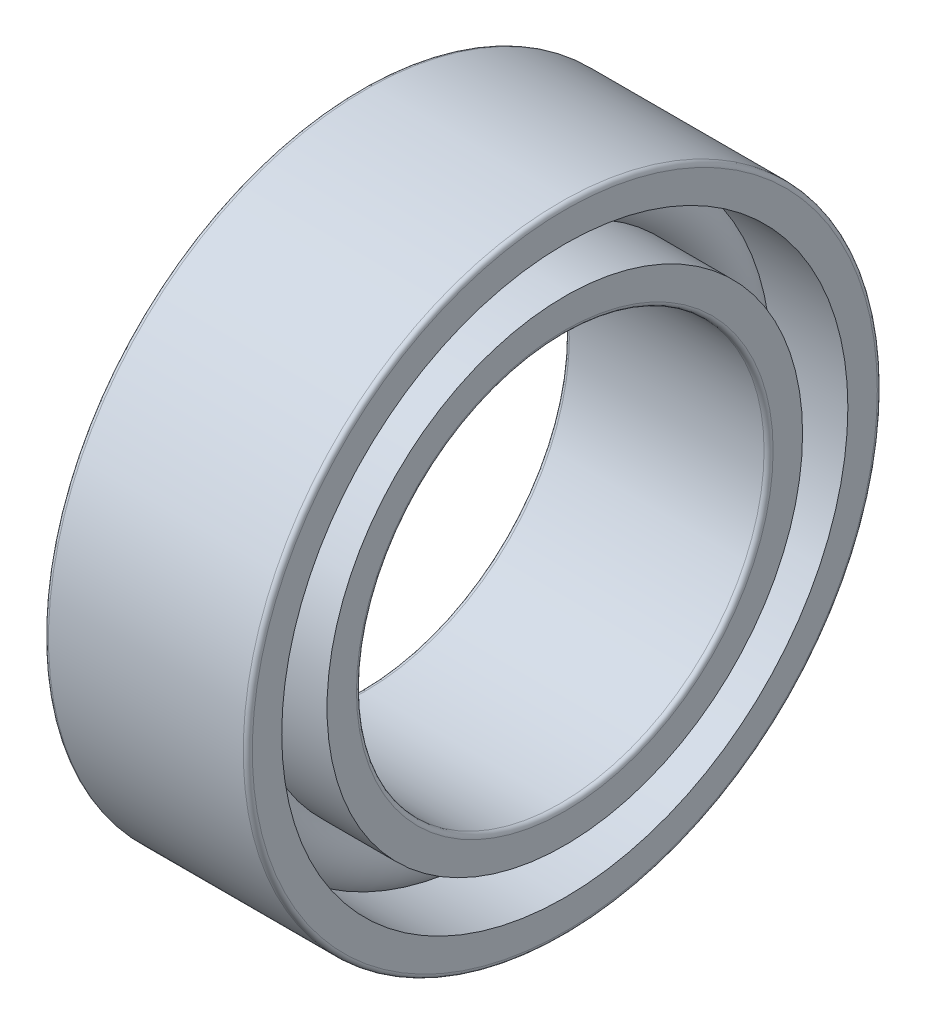
ISO-10303-21;
HEADER;
FILE_DESCRIPTION(('STEP AP214'),'2;1');
FILE_NAME('part.step','',(''),(''),'','','');
FILE_SCHEMA(('AUTOMOTIVE_DESIGN { 1 0 10303 214 1 1 1 1 }'));
ENDSEC;
DATA;
#1=APPLICATION_CONTEXT('core data for automotive mechanical design processes');
#2=APPLICATION_PROTOCOL_DEFINITION('international standard','automotive_design',2000,#1);
#3=PRODUCT_CONTEXT('',#1,'mechanical');
#4=PRODUCT('Part','Part','',(#3));
#5=PRODUCT_RELATED_PRODUCT_CATEGORY('part','',(#4));
#6=PRODUCT_DEFINITION_FORMATION('','',#4);
#7=PRODUCT_DEFINITION_CONTEXT('part definition',#1,'design');
#8=PRODUCT_DEFINITION('design','',#6,#7);
#9=PRODUCT_DEFINITION_SHAPE('','',#8);
#10=(LENGTH_UNIT() NAMED_UNIT(*) SI_UNIT(.MILLI.,.METRE.));
#11=(NAMED_UNIT(*) PLANE_ANGLE_UNIT() SI_UNIT($,.RADIAN.));
#12=(NAMED_UNIT(*) SI_UNIT($,.STERADIAN.) SOLID_ANGLE_UNIT());
#13=UNCERTAINTY_MEASURE_WITH_UNIT(LENGTH_MEASURE(1.E-05),#10,'distance_accuracy_value','');
#14=(GEOMETRIC_REPRESENTATION_CONTEXT(3) GLOBAL_UNCERTAINTY_ASSIGNED_CONTEXT((#13)) GLOBAL_UNIT_ASSIGNED_CONTEXT((#10,
#11,#12)) REPRESENTATION_CONTEXT('',''));
#15=CARTESIAN_POINT('',(0.,0.,0.));
#16=DIRECTION('',(0.,0.,1.));
#17=DIRECTION('',(1.,0.,0.));
#18=AXIS2_PLACEMENT_3D('',#15,#16,#17);
#19=CARTESIAN_POINT('',(0.,0.,0.));
#20=DIRECTION('',(-1.,0.,0.));
#21=DIRECTION('',(0.,0.,1.));
#22=AXIS2_PLACEMENT_3D('',#19,#20,#21);
#23=TOROIDAL_SURFACE('',#22,5.75,0.75);
#24=CARTESIAN_POINT('',(0.559016994374943,0.,0.));
#25=DIRECTION('',(-1.,0.,0.));
#26=DIRECTION('',(0.,0.,1.));
#27=AXIS2_PLACEMENT_3D('',#24,#25,#26);
#28=CIRCLE('',#27,6.25000000000001);
#29=CARTESIAN_POINT('',(0.559016994374943,0.,6.25000000000001));
#30=VERTEX_POINT('',#29);
#31=EDGE_CURVE('E37',#30,#30,#28,.F.);
#32=ORIENTED_EDGE('',*,*,#31,.T.);
#33=EDGE_LOOP('',(#32));
#34=FACE_BOUND('',#33,.T.);
#35=CARTESIAN_POINT('',(0.559016994374947,0.,0.));
#36=DIRECTION('',(-1.,0.,0.));
#37=DIRECTION('',(0.,0.,1.));
#38=AXIS2_PLACEMENT_3D('',#35,#36,#37);
#39=CIRCLE('',#38,5.25);
#40=CARTESIAN_POINT('',(0.559016994374947,0.,5.25));
#41=VERTEX_POINT('',#40);
#42=EDGE_CURVE('E10',#41,#41,#39,.T.);
#43=ORIENTED_EDGE('',*,*,#42,.T.);
#44=EDGE_LOOP('',(#43));
#45=FACE_BOUND('',#44,.T.);
#46=ADVANCED_FACE('F33',(#34,#45),#23,.T.);
#47=CARTESIAN_POINT('',(-20.6375,0.,0.));
#48=DIRECTION('',(1.,0.,0.));
#49=DIRECTION('',(0.,0.,-1.));
#50=AXIS2_PLACEMENT_3D('',#47,#48,#49);
#51=CYLINDRICAL_SURFACE('',#50,5.25);
#52=CARTESIAN_POINT('',(2.25,0.,0.));
#53=DIRECTION('',(1.,0.,0.));
#54=DIRECTION('',(0.,0.,-1.));
#55=AXIS2_PLACEMENT_3D('',#52,#53,#54);
#56=CIRCLE('',#55,5.25);
#57=CARTESIAN_POINT('',(2.25,0.,-5.25));
#58=VERTEX_POINT('',#57);
#59=EDGE_CURVE('E46',#58,#58,#56,.T.);
#60=ORIENTED_EDGE('',*,*,#59,.F.);
#61=EDGE_LOOP('',(#60));
#62=FACE_BOUND('',#61,.T.);
#63=ORIENTED_EDGE('',*,*,#42,.F.);
#64=EDGE_LOOP('',(#63));
#65=FACE_BOUND('',#64,.T.);
#66=ADVANCED_FACE('F85',(#62,#65),#51,.T.);
#67=CARTESIAN_POINT('',(-20.6375,0.,0.));
#68=DIRECTION('',(1.,0.,0.));
#69=DIRECTION('',(0.,0.,-1.));
#70=AXIS2_PLACEMENT_3D('',#67,#68,#69);
#71=CYLINDRICAL_SURFACE('',#70,5.25);
#72=CARTESIAN_POINT('',(-2.25,0.,0.));
#73=DIRECTION('',(1.,0.,0.));
#74=DIRECTION('',(0.,0.,-1.));
#75=AXIS2_PLACEMENT_3D('',#72,#73,#74);
#76=CIRCLE('',#75,5.25);
#77=CARTESIAN_POINT('',(-2.25,0.,-5.25));
#78=VERTEX_POINT('',#77);
#79=EDGE_CURVE('E55',#78,#78,#76,.T.);
#80=ORIENTED_EDGE('',*,*,#79,.T.);
#81=EDGE_LOOP('',(#80));
#82=FACE_BOUND('',#81,.T.);
#83=CARTESIAN_POINT('',(-0.559016994374947,0.,0.));
#84=DIRECTION('',(1.,0.,0.));
#85=DIRECTION('',(0.,0.,-1.));
#86=AXIS2_PLACEMENT_3D('',#83,#84,#85);
#87=CIRCLE('',#86,5.25);
#88=CARTESIAN_POINT('',(-0.559016994374947,0.,-5.25));
#89=VERTEX_POINT('',#88);
#90=EDGE_CURVE('E41',#89,#89,#87,.T.);
#91=ORIENTED_EDGE('',*,*,#90,.F.);
#92=EDGE_LOOP('',(#91));
#93=FACE_BOUND('',#92,.T.);
#94=ADVANCED_FACE('F88',(#82,#93),#71,.T.);
#95=CARTESIAN_POINT('',(2.25,4.6,0.));
#96=DIRECTION('',(1.,0.,0.));
#97=DIRECTION('',(0.,0.,-1.));
#98=AXIS2_PLACEMENT_3D('',#95,#96,#97);
#99=PLANE('',#98);
#100=ORIENTED_EDGE('',*,*,#59,.T.);
#101=EDGE_LOOP('',(#100));
#102=FACE_BOUND('',#101,.T.);
#103=CARTESIAN_POINT('',(2.25,0.,0.));
#104=DIRECTION('',(1.,0.,0.));
#105=DIRECTION('',(0.,0.,-1.));
#106=AXIS2_PLACEMENT_3D('',#103,#104,#105);
#107=CIRCLE('',#106,4.6);
#108=CARTESIAN_POINT('',(2.25,0.,-4.6));
#109=VERTEX_POINT('',#108);
#110=EDGE_CURVE('E77',#109,#109,#107,.T.);
#111=ORIENTED_EDGE('',*,*,#110,.F.);
#112=EDGE_LOOP('',(#111));
#113=FACE_BOUND('',#112,.T.);
#114=ADVANCED_FACE('F82',(#102,#113),#99,.T.);
#115=CARTESIAN_POINT('',(2.15,0.,0.));
#116=DIRECTION('',(1.,0.,0.));
#117=DIRECTION('',(0.,0.,-1.));
#118=AXIS2_PLACEMENT_3D('',#115,#116,#117);
#119=TOROIDAL_SURFACE('',#118,4.6,0.1);
#120=ORIENTED_EDGE('',*,*,#110,.T.);
#121=EDGE_LOOP('',(#120));
#122=FACE_BOUND('',#121,.T.);
#123=CARTESIAN_POINT('',(2.15,0.,0.));
#124=DIRECTION('',(1.,0.,0.));
#125=DIRECTION('',(0.,0.,-1.));
#126=AXIS2_PLACEMENT_3D('',#123,#124,#125);
#127=CIRCLE('',#126,4.5);
#128=CARTESIAN_POINT('',(2.15,0.,-4.5));
#129=VERTEX_POINT('',#128);
#130=EDGE_CURVE('E74',#129,#129,#127,.T.);
#131=ORIENTED_EDGE('',*,*,#130,.F.);
#132=EDGE_LOOP('',(#131));
#133=FACE_BOUND('',#132,.T.);
#134=ADVANCED_FACE('F99',(#122,#133),#119,.T.);
#135=CARTESIAN_POINT('',(-20.6375,0.,0.));
#136=DIRECTION('',(1.,0.,0.));
#137=DIRECTION('',(0.,0.,-1.));
#138=AXIS2_PLACEMENT_3D('',#135,#136,#137);
#139=CYLINDRICAL_SURFACE('',#138,4.5);
#140=ORIENTED_EDGE('',*,*,#130,.T.);
#141=EDGE_LOOP('',(#140));
#142=FACE_BOUND('',#141,.T.);
#143=CARTESIAN_POINT('',(-2.15,0.,0.));
#144=DIRECTION('',(1.,0.,0.));
#145=DIRECTION('',(0.,0.,-1.));
#146=AXIS2_PLACEMENT_3D('',#143,#144,#145);
#147=CIRCLE('',#146,4.5);
#148=CARTESIAN_POINT('',(-2.15,0.,-4.5));
#149=VERTEX_POINT('',#148);
#150=EDGE_CURVE('E71',#149,#149,#147,.T.);
#151=ORIENTED_EDGE('',*,*,#150,.F.);
#152=EDGE_LOOP('',(#151));
#153=FACE_BOUND('',#152,.T.);
#154=ADVANCED_FACE('F102',(#142,#153),#139,.F.);
#155=CARTESIAN_POINT('',(-2.15,0.,0.));
#156=DIRECTION('',(1.,0.,0.));
#157=DIRECTION('',(0.,0.,-1.));
#158=AXIS2_PLACEMENT_3D('',#155,#156,#157);
#159=TOROIDAL_SURFACE('',#158,4.6,0.1);
#160=ORIENTED_EDGE('',*,*,#150,.T.);
#161=EDGE_LOOP('',(#160));
#162=FACE_BOUND('',#161,.T.);
#163=CARTESIAN_POINT('',(-2.25,0.,0.));
#164=DIRECTION('',(1.,0.,0.));
#165=DIRECTION('',(0.,0.,-1.));
#166=AXIS2_PLACEMENT_3D('',#163,#164,#165);
#167=CIRCLE('',#166,4.6);
#168=CARTESIAN_POINT('',(-2.25,0.,-4.6));
#169=VERTEX_POINT('',#168);
#170=EDGE_CURVE('E68',#169,#169,#167,.T.);
#171=ORIENTED_EDGE('',*,*,#170,.F.);
#172=EDGE_LOOP('',(#171));
#173=FACE_BOUND('',#172,.T.);
#174=ADVANCED_FACE('F106',(#162,#173),#159,.T.);
#175=CARTESIAN_POINT('',(-2.25,5.25,0.));
#176=DIRECTION('',(-1.,0.,0.));
#177=DIRECTION('',(0.,0.,1.));
#178=AXIS2_PLACEMENT_3D('',#175,#176,#177);
#179=PLANE('',#178);
#180=ORIENTED_EDGE('',*,*,#170,.T.);
#181=EDGE_LOOP('',(#180));
#182=FACE_BOUND('',#181,.T.);
#183=ORIENTED_EDGE('',*,*,#79,.F.);
#184=EDGE_LOOP('',(#183));
#185=FACE_BOUND('',#184,.T.);
#186=ADVANCED_FACE('F110',(#182,#185),#179,.T.);
#187=CARTESIAN_POINT('',(-0.559016994374943,0.,0.));
#188=DIRECTION('',(1.,0.,0.));
#189=DIRECTION('',(0.,0.,-1.));
#190=AXIS2_PLACEMENT_3D('',#187,#188,#189);
#191=CIRCLE('',#190,6.25000000000001);
#192=CARTESIAN_POINT('',(-0.559016994374943,0.,-6.25000000000001));
#193=VERTEX_POINT('',#192);
#194=EDGE_CURVE('E49',#193,#193,#191,.F.);
#195=ORIENTED_EDGE('',*,*,#194,.T.);
#196=EDGE_LOOP('',(#195));
#197=FACE_BOUND('',#196,.T.);
#198=ORIENTED_EDGE('',*,*,#90,.T.);
#199=EDGE_LOOP('',(#198));
#200=FACE_BOUND('',#199,.T.);
#201=ADVANCED_FACE('F35',(#197,#200),#23,.T.);
#202=CARTESIAN_POINT('',(-20.6375,0.,0.));
#203=DIRECTION('',(1.,0.,0.));
#204=DIRECTION('',(0.,0.,-1.));
#205=AXIS2_PLACEMENT_3D('',#202,#203,#204);
#206=CYLINDRICAL_SURFACE('',#205,6.25000000000001);
#207=CARTESIAN_POINT('',(2.25,0.,0.));
#208=DIRECTION('',(1.,0.,0.));
#209=DIRECTION('',(0.,0.,-1.));
#210=AXIS2_PLACEMENT_3D('',#207,#208,#209);
#211=CIRCLE('',#210,6.25000000000001);
#212=CARTESIAN_POINT('',(2.25,0.,-6.25000000000001));
#213=VERTEX_POINT('',#212);
#214=EDGE_CURVE('E51',#213,#213,#211,.T.);
#215=ORIENTED_EDGE('',*,*,#214,.T.);
#216=EDGE_LOOP('',(#215));
#217=FACE_BOUND('',#216,.T.);
#218=ORIENTED_EDGE('',*,*,#31,.F.);
#219=EDGE_LOOP('',(#218));
#220=FACE_BOUND('',#219,.T.);
#221=ADVANCED_FACE('F115',(#217,#220),#206,.F.);
#222=CARTESIAN_POINT('',(-20.6375,0.,0.));
#223=DIRECTION('',(1.,0.,0.));
#224=DIRECTION('',(0.,0.,-1.));
#225=AXIS2_PLACEMENT_3D('',#222,#223,#224);
#226=CYLINDRICAL_SURFACE('',#225,6.25000000000001);
#227=CARTESIAN_POINT('',(-2.25,0.,0.));
#228=DIRECTION('',(1.,0.,0.));
#229=DIRECTION('',(0.,0.,-1.));
#230=AXIS2_PLACEMENT_3D('',#227,#228,#229);
#231=CIRCLE('',#230,6.25000000000001);
#232=CARTESIAN_POINT('',(-2.25,0.,-6.25000000000001));
#233=VERTEX_POINT('',#232);
#234=EDGE_CURVE('E146',#233,#233,#231,.T.);
#235=ORIENTED_EDGE('',*,*,#234,.F.);
#236=EDGE_LOOP('',(#235));
#237=FACE_BOUND('',#236,.T.);
#238=ORIENTED_EDGE('',*,*,#194,.F.);
#239=EDGE_LOOP('',(#238));
#240=FACE_BOUND('',#239,.T.);
#241=ADVANCED_FACE('F118',(#237,#240),#226,.F.);
#242=CARTESIAN_POINT('',(2.25,6.9,0.));
#243=DIRECTION('',(1.,0.,0.));
#244=DIRECTION('',(0.,0.,-1.));
#245=AXIS2_PLACEMENT_3D('',#242,#243,#244);
#246=PLANE('',#245);
#247=CARTESIAN_POINT('',(2.25,0.,0.));
#248=DIRECTION('',(1.,0.,0.));
#249=DIRECTION('',(0.,0.,-1.));
#250=AXIS2_PLACEMENT_3D('',#247,#248,#249);
#251=CIRCLE('',#250,6.9);
#252=CARTESIAN_POINT('',(2.25,0.,-6.9));
#253=VERTEX_POINT('',#252);
#254=EDGE_CURVE('E57',#253,#253,#251,.T.);
#255=ORIENTED_EDGE('',*,*,#254,.T.);
#256=EDGE_LOOP('',(#255));
#257=FACE_BOUND('',#256,.T.);
#258=ORIENTED_EDGE('',*,*,#214,.F.);
#259=EDGE_LOOP('',(#258));
#260=FACE_BOUND('',#259,.T.);
#261=ADVANCED_FACE('F119',(#257,#260),#246,.T.);
#262=CARTESIAN_POINT('',(2.15,0.,0.));
#263=DIRECTION('',(1.,0.,0.));
#264=DIRECTION('',(0.,0.,-1.));
#265=AXIS2_PLACEMENT_3D('',#262,#263,#264);
#266=TOROIDAL_SURFACE('',#265,6.9,0.100000000000001);
#267=CARTESIAN_POINT('',(2.15,0.,0.));
#268=DIRECTION('',(1.,0.,0.));
#269=DIRECTION('',(0.,0.,-1.));
#270=AXIS2_PLACEMENT_3D('',#267,#268,#269);
#271=CIRCLE('',#270,7.00000000000001);
#272=CARTESIAN_POINT('',(2.15,0.,-7.00000000000001));
#273=VERTEX_POINT('',#272);
#274=EDGE_CURVE('E62',#273,#273,#271,.T.);
#275=ORIENTED_EDGE('',*,*,#274,.T.);
#276=EDGE_LOOP('',(#275));
#277=FACE_BOUND('',#276,.T.);
#278=ORIENTED_EDGE('',*,*,#254,.F.);
#279=EDGE_LOOP('',(#278));
#280=FACE_BOUND('',#279,.T.);
#281=ADVANCED_FACE('F122',(#277,#280),#266,.T.);
#282=CARTESIAN_POINT('',(-20.6375,0.,0.));
#283=DIRECTION('',(1.,0.,0.));
#284=DIRECTION('',(0.,0.,-1.));
#285=AXIS2_PLACEMENT_3D('',#282,#283,#284);
#286=CYLINDRICAL_SURFACE('',#285,7.00000000000001);
#287=CARTESIAN_POINT('',(-2.15,0.,0.));
#288=DIRECTION('',(1.,0.,0.));
#289=DIRECTION('',(0.,0.,-1.));
#290=AXIS2_PLACEMENT_3D('',#287,#288,#289);
#291=CIRCLE('',#290,7.00000000000001);
#292=CARTESIAN_POINT('',(-2.15,0.,-7.00000000000001));
#293=VERTEX_POINT('',#292);
#294=EDGE_CURVE('E150',#293,#293,#291,.T.);
#295=ORIENTED_EDGE('',*,*,#294,.T.);
#296=EDGE_LOOP('',(#295));
#297=FACE_BOUND('',#296,.T.);
#298=ORIENTED_EDGE('',*,*,#274,.F.);
#299=EDGE_LOOP('',(#298));
#300=FACE_BOUND('',#299,.T.);
#301=ADVANCED_FACE('F126',(#297,#300),#286,.T.);
#302=CARTESIAN_POINT('',(-2.15,0.,0.));
#303=DIRECTION('',(1.,0.,0.));
#304=DIRECTION('',(0.,0.,-1.));
#305=AXIS2_PLACEMENT_3D('',#302,#303,#304);
#306=TOROIDAL_SURFACE('',#305,6.9,0.100000000000001);
#307=CARTESIAN_POINT('',(-2.25,0.,0.));
#308=DIRECTION('',(1.,0.,0.));
#309=DIRECTION('',(0.,0.,-1.));
#310=AXIS2_PLACEMENT_3D('',#307,#308,#309);
#311=CIRCLE('',#310,6.9);
#312=CARTESIAN_POINT('',(-2.25,0.,-6.9));
#313=VERTEX_POINT('',#312);
#314=EDGE_CURVE('E147',#313,#313,#311,.T.);
#315=ORIENTED_EDGE('',*,*,#314,.T.);
#316=EDGE_LOOP('',(#315));
#317=FACE_BOUND('',#316,.T.);
#318=ORIENTED_EDGE('',*,*,#294,.F.);
#319=EDGE_LOOP('',(#318));
#320=FACE_BOUND('',#319,.T.);
#321=ADVANCED_FACE('F130',(#317,#320),#306,.T.);
#322=CARTESIAN_POINT('',(-2.25,6.25000000000001,0.));
#323=DIRECTION('',(-1.,0.,0.));
#324=DIRECTION('',(0.,0.,1.));
#325=AXIS2_PLACEMENT_3D('',#322,#323,#324);
#326=PLANE('',#325);
#327=ORIENTED_EDGE('',*,*,#234,.T.);
#328=EDGE_LOOP('',(#327));
#329=FACE_BOUND('',#328,.T.);
#330=ORIENTED_EDGE('',*,*,#314,.F.);
#331=EDGE_LOOP('',(#330));
#332=FACE_BOUND('',#331,.T.);
#333=ADVANCED_FACE('F134',(#329,#332),#326,.T.);
#334=CLOSED_SHELL('',(#46,#66,#94,#114,#134,#154,#174,#186,#201,#221,#241,#261,#281,#301,#321,#333));
#335=MANIFOLD_SOLID_BREP('B2',#334);
#336=ADVANCED_BREP_SHAPE_REPRESENTATION('',(#18,#335),#14);
#337=SHAPE_DEFINITION_REPRESENTATION(#9,#336);
ENDSEC;
END-ISO-10303-21;
